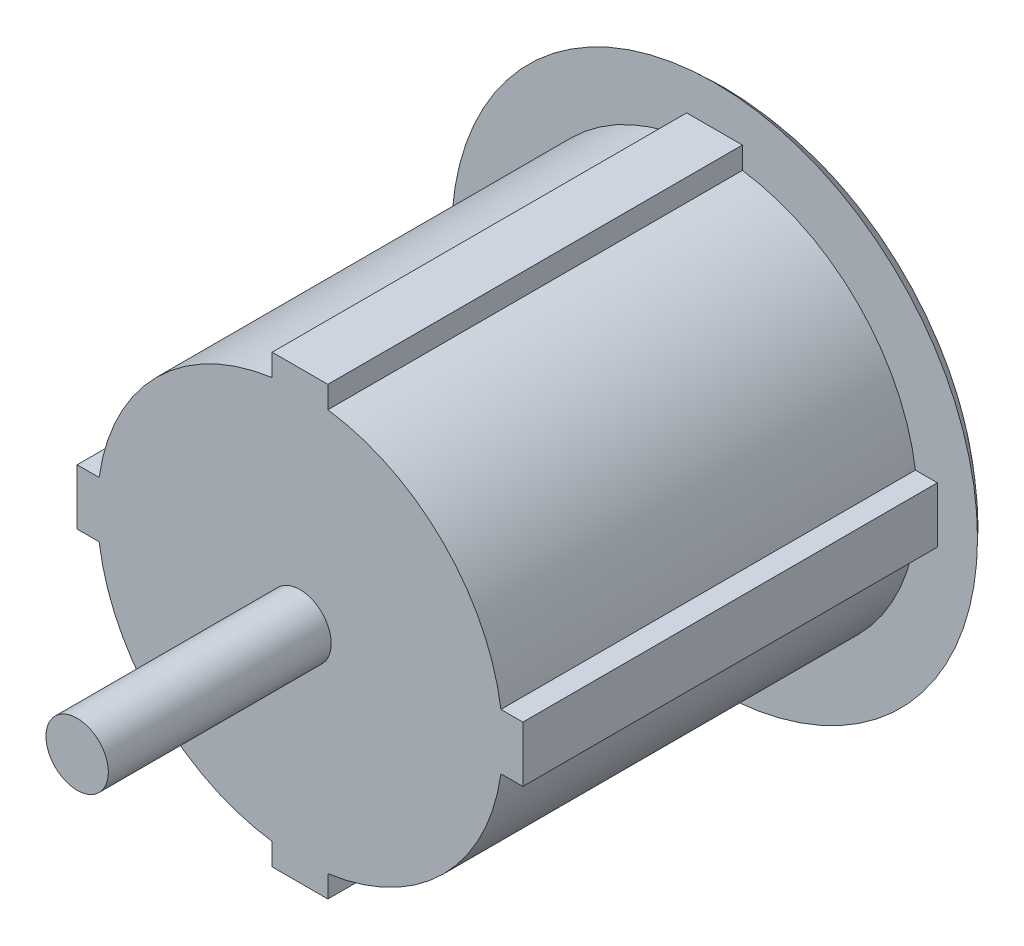
ISO-10303-21;
HEADER;
FILE_DESCRIPTION(('STEP AP214'),'2;1');
FILE_NAME('part.step','',(''),(''),'','','');
FILE_SCHEMA(('AUTOMOTIVE_DESIGN { 1 0 10303 214 1 1 1 1 }'));
ENDSEC;
DATA;
#1=APPLICATION_CONTEXT('core data for automotive mechanical design processes');
#2=APPLICATION_PROTOCOL_DEFINITION('international standard','automotive_design',2000,#1);
#3=PRODUCT_CONTEXT('',#1,'mechanical');
#4=PRODUCT('Part','Part','',(#3));
#5=PRODUCT_RELATED_PRODUCT_CATEGORY('part','',(#4));
#6=PRODUCT_DEFINITION_FORMATION('','',#4);
#7=PRODUCT_DEFINITION_CONTEXT('part definition',#1,'design');
#8=PRODUCT_DEFINITION('design','',#6,#7);
#9=PRODUCT_DEFINITION_SHAPE('','',#8);
#10=(LENGTH_UNIT() NAMED_UNIT(*) SI_UNIT(.MILLI.,.METRE.));
#11=(NAMED_UNIT(*) PLANE_ANGLE_UNIT() SI_UNIT($,.RADIAN.));
#12=(NAMED_UNIT(*) SI_UNIT($,.STERADIAN.) SOLID_ANGLE_UNIT());
#13=UNCERTAINTY_MEASURE_WITH_UNIT(LENGTH_MEASURE(1.E-05),#10,'distance_accuracy_value','');
#14=(GEOMETRIC_REPRESENTATION_CONTEXT(3) GLOBAL_UNCERTAINTY_ASSIGNED_CONTEXT((#13)) GLOBAL_UNIT_ASSIGNED_CONTEXT((#10,
#11,#12)) REPRESENTATION_CONTEXT('',''));
#15=CARTESIAN_POINT('',(0.,0.,0.));
#16=DIRECTION('',(0.,0.,1.));
#17=DIRECTION('',(1.,0.,0.));
#18=AXIS2_PLACEMENT_3D('',#15,#16,#17);
#19=CARTESIAN_POINT('',(0.,0.,20.4));
#20=DIRECTION('',(0.,0.,-1.));
#21=DIRECTION('',(-1.,0.,0.));
#22=AXIS2_PLACEMENT_3D('',#19,#20,#21);
#23=CYLINDRICAL_SURFACE('',#22,9.1);
#24=CARTESIAN_POINT('',(0.,0.,20.4));
#25=DIRECTION('',(0.,0.,1.));
#26=DIRECTION('',(1.,0.,0.));
#27=AXIS2_PLACEMENT_3D('',#24,#25,#26);
#28=CIRCLE('',#27,9.1);
#29=CARTESIAN_POINT('',(9.01373951254416,1.2500000000001,20.4));
#30=VERTEX_POINT('',#29);
#31=CARTESIAN_POINT('',(1.25,9.01373951254417,20.4));
#32=VERTEX_POINT('',#31);
#33=EDGE_CURVE('E277',#30,#32,#28,.T.);
#34=ORIENTED_EDGE('',*,*,#33,.F.);
#35=DIRECTION('',(0.,0.,-1.));
#36=VECTOR('',#35,1.);
#37=CARTESIAN_POINT('',(9.01373951254416,1.2500000000001,20.4));
#38=LINE('',#37,#36);
#39=CARTESIAN_POINT('',(9.01373951254416,1.2500000000001,1.8));
#40=VERTEX_POINT('',#39);
#41=EDGE_CURVE('E181',#30,#40,#38,.T.);
#42=ORIENTED_EDGE('',*,*,#41,.T.);
#43=CARTESIAN_POINT('',(0.,0.,1.8));
#44=DIRECTION('',(0.,0.,-1.));
#45=DIRECTION('',(-1.,0.,0.));
#46=AXIS2_PLACEMENT_3D('',#43,#44,#45);
#47=CIRCLE('',#46,9.1);
#48=CARTESIAN_POINT('',(1.25,9.01373951254417,1.8));
#49=VERTEX_POINT('',#48);
#50=EDGE_CURVE('E175',#49,#40,#47,.T.);
#51=ORIENTED_EDGE('',*,*,#50,.F.);
#52=DIRECTION('',(0.,0.,-1.));
#53=VECTOR('',#52,1.);
#54=CARTESIAN_POINT('',(1.25,9.01373951254417,20.4));
#55=LINE('',#54,#53);
#56=EDGE_CURVE('E250',#49,#32,#55,.F.);
#57=ORIENTED_EDGE('',*,*,#56,.T.);
#58=EDGE_LOOP('',(#34,#42,#51,#57));
#59=FACE_BOUND('',#58,.T.);
#60=ADVANCED_FACE('F37',(#59),#23,.T.);
#61=CARTESIAN_POINT('',(9.01373951254418,-1.2499999999999,1.8));
#62=VERTEX_POINT('',#61);
#63=CARTESIAN_POINT('',(1.25,-9.01373951254417,1.8));
#64=VERTEX_POINT('',#63);
#65=EDGE_CURVE('E282',#62,#64,#47,.T.);
#66=ORIENTED_EDGE('',*,*,#65,.F.);
#67=DIRECTION('',(0.,0.,-1.));
#68=VECTOR('',#67,1.);
#69=CARTESIAN_POINT('',(9.01373951254418,-1.2499999999999,20.4));
#70=LINE('',#69,#68);
#71=CARTESIAN_POINT('',(9.01373951254418,-1.2499999999999,20.4));
#72=VERTEX_POINT('',#71);
#73=EDGE_CURVE('E53',#62,#72,#70,.F.);
#74=ORIENTED_EDGE('',*,*,#73,.T.);
#75=CARTESIAN_POINT('',(1.25,-9.01373951254417,20.4));
#76=VERTEX_POINT('',#75);
#77=EDGE_CURVE('E626',#76,#72,#28,.T.);
#78=ORIENTED_EDGE('',*,*,#77,.F.);
#79=DIRECTION('',(0.,0.,-1.));
#80=VECTOR('',#79,1.);
#81=CARTESIAN_POINT('',(1.25,-9.01373951254417,20.4));
#82=LINE('',#81,#80);
#83=EDGE_CURVE('E203',#76,#64,#82,.T.);
#84=ORIENTED_EDGE('',*,*,#83,.T.);
#85=EDGE_LOOP('',(#66,#74,#78,#84));
#86=FACE_BOUND('',#85,.T.);
#87=ADVANCED_FACE('F292',(#86),#23,.T.);
#88=CARTESIAN_POINT('',(-1.25,-9.01373951254417,1.8));
#89=VERTEX_POINT('',#88);
#90=CARTESIAN_POINT('',(-9.01373951254416,-1.25000000000003,1.8));
#91=VERTEX_POINT('',#90);
#92=EDGE_CURVE('E295',#89,#91,#47,.T.);
#93=ORIENTED_EDGE('',*,*,#92,.F.);
#94=DIRECTION('',(0.,0.,-1.));
#95=VECTOR('',#94,1.);
#96=CARTESIAN_POINT('',(-1.25,-9.01373951254417,20.4));
#97=LINE('',#96,#95);
#98=CARTESIAN_POINT('',(-1.25,-9.01373951254417,20.4));
#99=VERTEX_POINT('',#98);
#100=EDGE_CURVE('E61',#89,#99,#97,.F.);
#101=ORIENTED_EDGE('',*,*,#100,.T.);
#102=CARTESIAN_POINT('',(-9.01373951254416,-1.25000000000003,20.4));
#103=VERTEX_POINT('',#102);
#104=EDGE_CURVE('E276',#103,#99,#28,.T.);
#105=ORIENTED_EDGE('',*,*,#104,.F.);
#106=DIRECTION('',(0.,0.,-1.));
#107=VECTOR('',#106,1.);
#108=CARTESIAN_POINT('',(-9.01373951254416,-1.25000000000003,20.4));
#109=LINE('',#108,#107);
#110=EDGE_CURVE('E228',#103,#91,#109,.T.);
#111=ORIENTED_EDGE('',*,*,#110,.T.);
#112=EDGE_LOOP('',(#93,#101,#105,#111));
#113=FACE_BOUND('',#112,.T.);
#114=ADVANCED_FACE('F342',(#113),#23,.T.);
#115=CARTESIAN_POINT('',(-9.01373951254418,1.24999999999997,1.8));
#116=VERTEX_POINT('',#115);
#117=CARTESIAN_POINT('',(-1.25,9.01373951254417,1.8));
#118=VERTEX_POINT('',#117);
#119=EDGE_CURVE('E275',#116,#118,#47,.T.);
#120=ORIENTED_EDGE('',*,*,#119,.F.);
#121=DIRECTION('',(0.,0.,-1.));
#122=VECTOR('',#121,1.);
#123=CARTESIAN_POINT('',(-9.01373951254417,1.24999999999997,20.4));
#124=LINE('',#123,#122);
#125=CARTESIAN_POINT('',(-9.01373951254418,1.24999999999997,20.4));
#126=VERTEX_POINT('',#125);
#127=EDGE_CURVE('E225',#116,#126,#124,.F.);
#128=ORIENTED_EDGE('',*,*,#127,.T.);
#129=CARTESIAN_POINT('',(-1.25,9.01373951254417,20.4));
#130=VERTEX_POINT('',#129);
#131=EDGE_CURVE('E272',#130,#126,#28,.T.);
#132=ORIENTED_EDGE('',*,*,#131,.F.);
#133=DIRECTION('',(0.,0.,-1.));
#134=VECTOR('',#133,1.);
#135=CARTESIAN_POINT('',(-1.25,9.01373951254417,20.4));
#136=LINE('',#135,#134);
#137=EDGE_CURVE('E253',#130,#118,#136,.T.);
#138=ORIENTED_EDGE('',*,*,#137,.T.);
#139=EDGE_LOOP('',(#120,#128,#132,#138));
#140=FACE_BOUND('',#139,.T.);
#141=ADVANCED_FACE('F39',(#140),#23,.T.);
#142=CARTESIAN_POINT('',(0.,0.,20.4));
#143=DIRECTION('',(0.,0.,1.));
#144=DIRECTION('',(1.,0.,0.));
#145=AXIS2_PLACEMENT_3D('',#142,#143,#144);
#146=PLANE('',#145);
#147=CARTESIAN_POINT('',(0.,0.,20.4));
#148=DIRECTION('',(0.,0.,1.));
#149=DIRECTION('',(1.,0.,0.));
#150=AXIS2_PLACEMENT_3D('',#147,#148,#149);
#151=CIRCLE('',#150,1.4);
#152=CARTESIAN_POINT('',(1.4,0.,20.4));
#153=VERTEX_POINT('',#152);
#154=EDGE_CURVE('E11',#153,#153,#151,.T.);
#155=ORIENTED_EDGE('',*,*,#154,.F.);
#156=EDGE_LOOP('',(#155));
#157=FACE_BOUND('',#156,.T.);
#158=ORIENTED_EDGE('',*,*,#77,.T.);
#159=DIRECTION('',(1.,0.,0.));
#160=VECTOR('',#159,1.);
#161=CARTESIAN_POINT('',(10.,-1.24999999999989,20.4));
#162=LINE('',#161,#160);
#163=CARTESIAN_POINT('',(10.,-1.24999999999989,20.4));
#164=VERTEX_POINT('',#163);
#165=EDGE_CURVE('E318',#72,#164,#162,.T.);
#166=ORIENTED_EDGE('',*,*,#165,.T.);
#167=DIRECTION('',(0.,1.,0.));
#168=VECTOR('',#167,1.);
#169=CARTESIAN_POINT('',(9.99999999999999,1.25000000000011,20.4));
#170=LINE('',#169,#168);
#171=CARTESIAN_POINT('',(9.99999999999999,1.25000000000011,20.4));
#172=VERTEX_POINT('',#171);
#173=EDGE_CURVE('E316',#164,#172,#170,.T.);
#174=ORIENTED_EDGE('',*,*,#173,.T.);
#175=DIRECTION('',(-1.,0.,0.));
#176=VECTOR('',#175,1.);
#177=CARTESIAN_POINT('',(9.99999999999999,1.25000000000011,20.4));
#178=LINE('',#177,#176);
#179=EDGE_CURVE('E157',#172,#30,#178,.T.);
#180=ORIENTED_EDGE('',*,*,#179,.T.);
#181=ORIENTED_EDGE('',*,*,#33,.T.);
#182=DIRECTION('',(0.,1.,0.));
#183=VECTOR('',#182,1.);
#184=CARTESIAN_POINT('',(1.25,10.,20.4));
#185=LINE('',#184,#183);
#186=CARTESIAN_POINT('',(1.25,10.,20.4));
#187=VERTEX_POINT('',#186);
#188=EDGE_CURVE('E231',#32,#187,#185,.T.);
#189=ORIENTED_EDGE('',*,*,#188,.T.);
#190=DIRECTION('',(-1.,0.,0.));
#191=VECTOR('',#190,1.);
#192=CARTESIAN_POINT('',(-1.25,10.,20.4));
#193=LINE('',#192,#191);
#194=CARTESIAN_POINT('',(-1.25,10.,20.4));
#195=VERTEX_POINT('',#194);
#196=EDGE_CURVE('E236',#187,#195,#193,.T.);
#197=ORIENTED_EDGE('',*,*,#196,.T.);
#198=DIRECTION('',(0.,-1.,0.));
#199=VECTOR('',#198,1.);
#200=CARTESIAN_POINT('',(-1.25,10.,20.4));
#201=LINE('',#200,#199);
#202=EDGE_CURVE('E232',#195,#130,#201,.T.);
#203=ORIENTED_EDGE('',*,*,#202,.T.);
#204=ORIENTED_EDGE('',*,*,#131,.T.);
#205=DIRECTION('',(-1.,0.,0.));
#206=VECTOR('',#205,1.);
#207=CARTESIAN_POINT('',(-10.,1.24999999999996,20.4));
#208=LINE('',#207,#206);
#209=CARTESIAN_POINT('',(-10.,1.24999999999996,20.4));
#210=VERTEX_POINT('',#209);
#211=EDGE_CURVE('E206',#126,#210,#208,.T.);
#212=ORIENTED_EDGE('',*,*,#211,.T.);
#213=DIRECTION('',(0.,-1.,0.));
#214=VECTOR('',#213,1.);
#215=CARTESIAN_POINT('',(-9.99999999999999,-1.25000000000004,20.4));
#216=LINE('',#215,#214);
#217=CARTESIAN_POINT('',(-9.99999999999999,-1.25000000000004,20.4));
#218=VERTEX_POINT('',#217);
#219=EDGE_CURVE('E211',#210,#218,#216,.T.);
#220=ORIENTED_EDGE('',*,*,#219,.T.);
#221=DIRECTION('',(1.,0.,0.));
#222=VECTOR('',#221,1.);
#223=CARTESIAN_POINT('',(-9.99999999999999,-1.25000000000004,20.4));
#224=LINE('',#223,#222);
#225=EDGE_CURVE('E207',#218,#103,#224,.T.);
#226=ORIENTED_EDGE('',*,*,#225,.T.);
#227=ORIENTED_EDGE('',*,*,#104,.T.);
#228=DIRECTION('',(0.,-1.,0.));
#229=VECTOR('',#228,1.);
#230=CARTESIAN_POINT('',(-1.25,-10.,20.4));
#231=LINE('',#230,#229);
#232=CARTESIAN_POINT('',(-1.25,-10.,20.4));
#233=VERTEX_POINT('',#232);
#234=EDGE_CURVE('E183',#99,#233,#231,.T.);
#235=ORIENTED_EDGE('',*,*,#234,.T.);
#236=DIRECTION('',(1.,0.,0.));
#237=VECTOR('',#236,1.);
#238=CARTESIAN_POINT('',(1.25,-10.,20.4));
#239=LINE('',#238,#237);
#240=CARTESIAN_POINT('',(1.25,-10.,20.4));
#241=VERTEX_POINT('',#240);
#242=EDGE_CURVE('E188',#233,#241,#239,.T.);
#243=ORIENTED_EDGE('',*,*,#242,.T.);
#244=DIRECTION('',(0.,1.,0.));
#245=VECTOR('',#244,1.);
#246=CARTESIAN_POINT('',(1.25,-10.,20.4));
#247=LINE('',#246,#245);
#248=EDGE_CURVE('E184',#241,#76,#247,.T.);
#249=ORIENTED_EDGE('',*,*,#248,.T.);
#250=EDGE_LOOP('',(#158,#166,#174,#180,#181,#189,#197,#203,#204,#212,#220,#226,#227,#235,#243,#249));
#251=FACE_BOUND('',#250,.T.);
#252=ADVANCED_FACE('F307',(#157,#251),#146,.T.);
#253=CARTESIAN_POINT('',(0.,0.,5.70630595396058));
#254=DIRECTION('',(0.,0.,1.));
#255=DIRECTION('',(1.,0.,0.));
#256=AXIS2_PLACEMENT_3D('',#253,#254,#255);
#257=TOROIDAL_SURFACE('',#256,7.24579603069295,6.);
#258=CARTESIAN_POINT('',(0.,0.,1.8));
#259=DIRECTION('',(0.,0.,1.));
#260=DIRECTION('',(1.,0.,0.));
#261=AXIS2_PLACEMENT_3D('',#258,#259,#260);
#262=CIRCLE('',#261,11.8);
#263=CARTESIAN_POINT('',(11.8,0.,1.8));
#264=VERTEX_POINT('',#263);
#265=EDGE_CURVE('E266',#264,#264,#262,.T.);
#266=ORIENTED_EDGE('',*,*,#265,.F.);
#267=EDGE_LOOP('',(#266));
#268=FACE_BOUND('',#267,.T.);
#269=CARTESIAN_POINT('',(0.,0.,0.));
#270=DIRECTION('',(0.,0.,1.));
#271=DIRECTION('',(1.,0.,0.));
#272=AXIS2_PLACEMENT_3D('',#269,#270,#271);
#273=CIRCLE('',#272,9.1);
#274=CARTESIAN_POINT('',(9.1,0.,0.));
#275=VERTEX_POINT('',#274);
#276=EDGE_CURVE('E271',#275,#275,#273,.T.);
#277=ORIENTED_EDGE('',*,*,#276,.T.);
#278=EDGE_LOOP('',(#277));
#279=FACE_BOUND('',#278,.T.);
#280=ADVANCED_FACE('F334',(#268,#279),#257,.T.);
#281=CARTESIAN_POINT('',(0.,9.1,1.8));
#282=DIRECTION('',(0.,0.,-1.));
#283=DIRECTION('',(-1.,0.,0.));
#284=AXIS2_PLACEMENT_3D('',#281,#282,#283);
#285=PLANE('',#284);
#286=ORIENTED_EDGE('',*,*,#50,.T.);
#287=DIRECTION('',(-1.,0.,0.));
#288=VECTOR('',#287,1.);
#289=CARTESIAN_POINT('',(9.99999999999999,1.25000000000011,1.8));
#290=LINE('',#289,#288);
#291=CARTESIAN_POINT('',(9.99999999999999,1.25000000000011,1.8));
#292=VERTEX_POINT('',#291);
#293=EDGE_CURVE('E154',#292,#40,#290,.T.);
#294=ORIENTED_EDGE('',*,*,#293,.F.);
#295=DIRECTION('',(0.,1.,0.));
#296=VECTOR('',#295,1.);
#297=CARTESIAN_POINT('',(9.99999999999999,1.25000000000011,1.8));
#298=LINE('',#297,#296);
#299=CARTESIAN_POINT('',(10.,-1.24999999999989,1.8));
#300=VERTEX_POINT('',#299);
#301=EDGE_CURVE('E161',#300,#292,#298,.T.);
#302=ORIENTED_EDGE('',*,*,#301,.F.);
#303=DIRECTION('',(-1.,0.,0.));
#304=VECTOR('',#303,1.);
#305=CARTESIAN_POINT('',(1.10654794068124E-13,-1.25,1.8));
#306=LINE('',#305,#304);
#307=EDGE_CURVE('E41',#300,#62,#306,.T.);
#308=ORIENTED_EDGE('',*,*,#307,.T.);
#309=ORIENTED_EDGE('',*,*,#65,.T.);
#310=DIRECTION('',(0.,1.,0.));
#311=VECTOR('',#310,1.);
#312=CARTESIAN_POINT('',(1.25,-10.,1.8));
#313=LINE('',#312,#311);
#314=CARTESIAN_POINT('',(1.25,-10.,1.8));
#315=VERTEX_POINT('',#314);
#316=EDGE_CURVE('E195',#315,#64,#313,.T.);
#317=ORIENTED_EDGE('',*,*,#316,.F.);
#318=DIRECTION('',(1.,0.,0.));
#319=VECTOR('',#318,1.);
#320=CARTESIAN_POINT('',(1.25,-10.,1.8));
#321=LINE('',#320,#319);
#322=CARTESIAN_POINT('',(-1.25,-10.,1.8));
#323=VERTEX_POINT('',#322);
#324=EDGE_CURVE('E187',#323,#315,#321,.T.);
#325=ORIENTED_EDGE('',*,*,#324,.F.);
#326=DIRECTION('',(0.,1.,0.));
#327=VECTOR('',#326,1.);
#328=CARTESIAN_POINT('',(-1.25,9.1,1.8));
#329=LINE('',#328,#327);
#330=EDGE_CURVE('E286',#323,#89,#329,.T.);
#331=ORIENTED_EDGE('',*,*,#330,.T.);
#332=ORIENTED_EDGE('',*,*,#92,.T.);
#333=DIRECTION('',(1.,0.,0.));
#334=VECTOR('',#333,1.);
#335=CARTESIAN_POINT('',(-9.99999999999999,-1.25000000000004,1.8));
#336=LINE('',#335,#334);
#337=CARTESIAN_POINT('',(-9.99999999999999,-1.25000000000004,1.8));
#338=VERTEX_POINT('',#337);
#339=EDGE_CURVE('E218',#338,#91,#336,.T.);
#340=ORIENTED_EDGE('',*,*,#339,.F.);
#341=DIRECTION('',(0.,-1.,0.));
#342=VECTOR('',#341,1.);
#343=CARTESIAN_POINT('',(-9.99999999999999,-1.25000000000004,1.8));
#344=LINE('',#343,#342);
#345=CARTESIAN_POINT('',(-10.,1.24999999999996,1.8));
#346=VERTEX_POINT('',#345);
#347=EDGE_CURVE('E210',#346,#338,#344,.T.);
#348=ORIENTED_EDGE('',*,*,#347,.F.);
#349=DIRECTION('',(1.,0.,0.));
#350=VECTOR('',#349,1.);
#351=CARTESIAN_POINT('',(0.,1.25,1.8));
#352=LINE('',#351,#350);
#353=EDGE_CURVE('E284',#346,#116,#352,.T.);
#354=ORIENTED_EDGE('',*,*,#353,.T.);
#355=ORIENTED_EDGE('',*,*,#119,.T.);
#356=DIRECTION('',(0.,-1.,0.));
#357=VECTOR('',#356,1.);
#358=CARTESIAN_POINT('',(-1.25,10.,1.8));
#359=LINE('',#358,#357);
#360=CARTESIAN_POINT('',(-1.25,10.,1.8));
#361=VERTEX_POINT('',#360);
#362=EDGE_CURVE('E243',#361,#118,#359,.T.);
#363=ORIENTED_EDGE('',*,*,#362,.F.);
#364=DIRECTION('',(-1.,0.,0.));
#365=VECTOR('',#364,1.);
#366=CARTESIAN_POINT('',(-1.25,10.,1.8));
#367=LINE('',#366,#365);
#368=CARTESIAN_POINT('',(1.25,10.,1.8));
#369=VERTEX_POINT('',#368);
#370=EDGE_CURVE('E235',#369,#361,#367,.T.);
#371=ORIENTED_EDGE('',*,*,#370,.F.);
#372=DIRECTION('',(0.,-1.,0.));
#373=VECTOR('',#372,1.);
#374=CARTESIAN_POINT('',(1.25,9.1,1.8));
#375=LINE('',#374,#373);
#376=EDGE_CURVE('E281',#369,#49,#375,.T.);
#377=ORIENTED_EDGE('',*,*,#376,.T.);
#378=EDGE_LOOP('',(#286,#294,#302,#308,#309,#317,#325,#331,#332,#340,#348,#354,#355,#363,#371,#377));
#379=FACE_BOUND('',#378,.T.);
#380=ORIENTED_EDGE('',*,*,#265,.T.);
#381=EDGE_LOOP('',(#380));
#382=FACE_BOUND('',#381,.T.);
#383=ADVANCED_FACE('F171',(#379,#382),#285,.F.);
#384=CARTESIAN_POINT('',(0.,0.,0.));
#385=DIRECTION('',(0.,0.,1.));
#386=DIRECTION('',(1.,0.,0.));
#387=AXIS2_PLACEMENT_3D('',#384,#385,#386);
#388=PLANE('',#387);
#389=CARTESIAN_POINT('',(0.,0.,0.));
#390=DIRECTION('',(0.,0.,-1.));
#391=DIRECTION('',(-1.,0.,0.));
#392=AXIS2_PLACEMENT_3D('',#389,#390,#391);
#393=CIRCLE('',#392,8.29473713611086);
#394=CARTESIAN_POINT('',(-8.29473713611086,0.,0.));
#395=VERTEX_POINT('',#394);
#396=EDGE_CURVE('E260',#395,#395,#393,.T.);
#397=ORIENTED_EDGE('',*,*,#396,.F.);
#398=EDGE_LOOP('',(#397));
#399=FACE_BOUND('',#398,.T.);
#400=ORIENTED_EDGE('',*,*,#276,.F.);
#401=EDGE_LOOP('',(#400));
#402=FACE_BOUND('',#401,.T.);
#403=ADVANCED_FACE('F396',(#399,#402),#388,.F.);
#404=CARTESIAN_POINT('',(0.,0.,0.5));
#405=DIRECTION('',(0.,0.,-1.));
#406=DIRECTION('',(-1.,0.,0.));
#407=AXIS2_PLACEMENT_3D('',#404,#405,#406);
#408=CYLINDRICAL_SURFACE('',#407,8.29473713611086);
#409=CARTESIAN_POINT('',(0.,0.,0.5));
#410=DIRECTION('',(0.,0.,-1.));
#411=DIRECTION('',(-1.,0.,0.));
#412=AXIS2_PLACEMENT_3D('',#409,#410,#411);
#413=CIRCLE('',#412,8.29473713611086);
#414=CARTESIAN_POINT('',(-8.29473713611086,0.,0.5));
#415=VERTEX_POINT('',#414);
#416=EDGE_CURVE('E263',#415,#415,#413,.T.);
#417=ORIENTED_EDGE('',*,*,#416,.F.);
#418=EDGE_LOOP('',(#417));
#419=FACE_BOUND('',#418,.T.);
#420=ORIENTED_EDGE('',*,*,#396,.T.);
#421=EDGE_LOOP('',(#420));
#422=FACE_BOUND('',#421,.T.);
#423=ADVANCED_FACE('F392',(#419,#422),#408,.F.);
#424=CARTESIAN_POINT('',(0.,0.,0.5));
#425=DIRECTION('',(0.,0.,-1.));
#426=DIRECTION('',(-1.,0.,0.));
#427=AXIS2_PLACEMENT_3D('',#424,#425,#426);
#428=PLANE('',#427);
#429=CARTESIAN_POINT('',(0.,0.,0.5));
#430=DIRECTION('',(0.,0.,-1.));
#431=DIRECTION('',(-1.,0.,0.));
#432=AXIS2_PLACEMENT_3D('',#429,#430,#431);
#433=CIRCLE('',#432,7.29473713611086);
#434=CARTESIAN_POINT('',(-7.29473713611086,0.,0.5));
#435=VERTEX_POINT('',#434);
#436=EDGE_CURVE('E257',#435,#435,#433,.T.);
#437=ORIENTED_EDGE('',*,*,#436,.F.);
#438=EDGE_LOOP('',(#437));
#439=FACE_BOUND('',#438,.T.);
#440=ORIENTED_EDGE('',*,*,#416,.T.);
#441=EDGE_LOOP('',(#440));
#442=FACE_BOUND('',#441,.T.);
#443=ADVANCED_FACE('F388',(#439,#442),#428,.T.);
#444=CARTESIAN_POINT('',(0.,0.,0.5));
#445=DIRECTION('',(0.,0.,-1.));
#446=DIRECTION('',(-1.,0.,0.));
#447=AXIS2_PLACEMENT_3D('',#444,#445,#446);
#448=CYLINDRICAL_SURFACE('',#447,7.29473713611086);
#449=ORIENTED_EDGE('',*,*,#436,.T.);
#450=EDGE_LOOP('',(#449));
#451=FACE_BOUND('',#450,.T.);
#452=CARTESIAN_POINT('',(0.,0.,0.));
#453=DIRECTION('',(0.,0.,-1.));
#454=DIRECTION('',(-1.,0.,0.));
#455=AXIS2_PLACEMENT_3D('',#452,#453,#454);
#456=CIRCLE('',#455,7.29473713611086);
#457=CARTESIAN_POINT('',(-7.29473713611086,0.,0.));
#458=VERTEX_POINT('',#457);
#459=EDGE_CURVE('E256',#458,#458,#456,.T.);
#460=ORIENTED_EDGE('',*,*,#459,.F.);
#461=EDGE_LOOP('',(#460));
#462=FACE_BOUND('',#461,.T.);
#463=ADVANCED_FACE('F385',(#451,#462),#448,.T.);
#464=ORIENTED_EDGE('',*,*,#459,.T.);
#465=EDGE_LOOP('',(#464));
#466=FACE_BOUND('',#465,.T.);
#467=ADVANCED_FACE('F382',(#466),#388,.F.);
#468=CARTESIAN_POINT('',(-1.25,10.,-1.40156211871642));
#469=DIRECTION('',(-1.,0.,0.));
#470=DIRECTION('',(0.,-1.,0.));
#471=AXIS2_PLACEMENT_3D('',#468,#469,#470);
#472=PLANE('',#471);
#473=ORIENTED_EDGE('',*,*,#137,.F.);
#474=ORIENTED_EDGE('',*,*,#202,.F.);
#475=DIRECTION('',(0.,0.,1.));
#476=VECTOR('',#475,1.);
#477=CARTESIAN_POINT('',(-1.25,10.,-1.40156211871642));
#478=LINE('',#477,#476);
#479=EDGE_CURVE('E242',#361,#195,#478,.T.);
#480=ORIENTED_EDGE('',*,*,#479,.F.);
#481=ORIENTED_EDGE('',*,*,#362,.T.);
#482=EDGE_LOOP('',(#473,#474,#480,#481));
#483=FACE_BOUND('',#482,.T.);
#484=ADVANCED_FACE('F303',(#483),#472,.T.);
#485=CARTESIAN_POINT('',(1.25,10.,-1.40156211871642));
#486=DIRECTION('',(1.,0.,0.));
#487=DIRECTION('',(0.,1.,0.));
#488=AXIS2_PLACEMENT_3D('',#485,#486,#487);
#489=PLANE('',#488);
#490=ORIENTED_EDGE('',*,*,#56,.F.);
#491=ORIENTED_EDGE('',*,*,#376,.F.);
#492=DIRECTION('',(0.,0.,1.));
#493=VECTOR('',#492,1.);
#494=CARTESIAN_POINT('',(1.25,10.,-1.40156211871642));
#495=LINE('',#494,#493);
#496=EDGE_CURVE('E246',#369,#187,#495,.T.);
#497=ORIENTED_EDGE('',*,*,#496,.T.);
#498=ORIENTED_EDGE('',*,*,#188,.F.);
#499=EDGE_LOOP('',(#490,#491,#497,#498));
#500=FACE_BOUND('',#499,.T.);
#501=ADVANCED_FACE('F377',(#500),#489,.T.);
#502=CARTESIAN_POINT('',(-1.25,10.,-1.40156211871642));
#503=DIRECTION('',(0.,1.,0.));
#504=DIRECTION('',(0.,0.,1.));
#505=AXIS2_PLACEMENT_3D('',#502,#503,#504);
#506=PLANE('',#505);
#507=ORIENTED_EDGE('',*,*,#496,.F.);
#508=ORIENTED_EDGE('',*,*,#370,.T.);
#509=ORIENTED_EDGE('',*,*,#479,.T.);
#510=ORIENTED_EDGE('',*,*,#196,.F.);
#511=EDGE_LOOP('',(#507,#508,#509,#510));
#512=FACE_BOUND('',#511,.T.);
#513=ADVANCED_FACE('F312',(#512),#506,.T.);
#514=CARTESIAN_POINT('',(-9.99999999999999,-1.25000000000004,-1.40156211871644));
#515=DIRECTION('',(0.,-1.,0.));
#516=DIRECTION('',(1.,0.,0.));
#517=AXIS2_PLACEMENT_3D('',#514,#515,#516);
#518=PLANE('',#517);
#519=ORIENTED_EDGE('',*,*,#110,.F.);
#520=ORIENTED_EDGE('',*,*,#225,.F.);
#521=DIRECTION('',(0.,0.,1.));
#522=VECTOR('',#521,1.);
#523=CARTESIAN_POINT('',(-9.99999999999999,-1.25000000000004,-1.40156211871644));
#524=LINE('',#523,#522);
#525=EDGE_CURVE('E217',#338,#218,#524,.T.);
#526=ORIENTED_EDGE('',*,*,#525,.F.);
#527=ORIENTED_EDGE('',*,*,#339,.T.);
#528=EDGE_LOOP('',(#519,#520,#526,#527));
#529=FACE_BOUND('',#528,.T.);
#530=ADVANCED_FACE('F357',(#529),#518,.T.);
#531=CARTESIAN_POINT('',(-10.,1.24999999999996,-1.40156211871644));
#532=DIRECTION('',(0.,1.,0.));
#533=DIRECTION('',(-1.,0.,0.));
#534=AXIS2_PLACEMENT_3D('',#531,#532,#533);
#535=PLANE('',#534);
#536=ORIENTED_EDGE('',*,*,#127,.F.);
#537=ORIENTED_EDGE('',*,*,#353,.F.);
#538=DIRECTION('',(0.,0.,1.));
#539=VECTOR('',#538,1.);
#540=CARTESIAN_POINT('',(-10.,1.24999999999996,-1.40156211871644));
#541=LINE('',#540,#539);
#542=EDGE_CURVE('E221',#346,#210,#541,.T.);
#543=ORIENTED_EDGE('',*,*,#542,.T.);
#544=ORIENTED_EDGE('',*,*,#211,.F.);
#545=EDGE_LOOP('',(#536,#537,#543,#544));
#546=FACE_BOUND('',#545,.T.);
#547=ADVANCED_FACE('F363',(#546),#535,.T.);
#548=CARTESIAN_POINT('',(-9.99999999999999,-1.25000000000004,-1.40156211871644));
#549=DIRECTION('',(-1.,0.,0.));
#550=DIRECTION('',(0.,-1.,0.));
#551=AXIS2_PLACEMENT_3D('',#548,#549,#550);
#552=PLANE('',#551);
#553=ORIENTED_EDGE('',*,*,#542,.F.);
#554=ORIENTED_EDGE('',*,*,#347,.T.);
#555=ORIENTED_EDGE('',*,*,#525,.T.);
#556=ORIENTED_EDGE('',*,*,#219,.F.);
#557=EDGE_LOOP('',(#553,#554,#555,#556));
#558=FACE_BOUND('',#557,.T.);
#559=ADVANCED_FACE('F361',(#558),#552,.T.);
#560=CARTESIAN_POINT('',(1.25,-10.,-1.40156211871642));
#561=DIRECTION('',(1.,0.,0.));
#562=DIRECTION('',(0.,1.,0.));
#563=AXIS2_PLACEMENT_3D('',#560,#561,#562);
#564=PLANE('',#563);
#565=ORIENTED_EDGE('',*,*,#83,.F.);
#566=ORIENTED_EDGE('',*,*,#248,.F.);
#567=DIRECTION('',(0.,0.,1.));
#568=VECTOR('',#567,1.);
#569=CARTESIAN_POINT('',(1.25,-10.,-1.40156211871642));
#570=LINE('',#569,#568);
#571=EDGE_CURVE('E194',#315,#241,#570,.T.);
#572=ORIENTED_EDGE('',*,*,#571,.F.);
#573=ORIENTED_EDGE('',*,*,#316,.T.);
#574=EDGE_LOOP('',(#565,#566,#572,#573));
#575=FACE_BOUND('',#574,.T.);
#576=ADVANCED_FACE('F370',(#575),#564,.T.);
#577=CARTESIAN_POINT('',(-1.25,-10.,-1.40156211871642));
#578=DIRECTION('',(-1.,0.,0.));
#579=DIRECTION('',(0.,-1.,0.));
#580=AXIS2_PLACEMENT_3D('',#577,#578,#579);
#581=PLANE('',#580);
#582=ORIENTED_EDGE('',*,*,#100,.F.);
#583=ORIENTED_EDGE('',*,*,#330,.F.);
#584=DIRECTION('',(0.,0.,1.));
#585=VECTOR('',#584,1.);
#586=CARTESIAN_POINT('',(-1.25,-10.,-1.40156211871642));
#587=LINE('',#586,#585);
#588=EDGE_CURVE('E198',#323,#233,#587,.T.);
#589=ORIENTED_EDGE('',*,*,#588,.T.);
#590=ORIENTED_EDGE('',*,*,#234,.F.);
#591=EDGE_LOOP('',(#582,#583,#589,#590));
#592=FACE_BOUND('',#591,.T.);
#593=ADVANCED_FACE('F458',(#592),#581,.T.);
#594=CARTESIAN_POINT('',(1.25,-10.,-1.40156211871642));
#595=DIRECTION('',(0.,-1.,0.));
#596=DIRECTION('',(0.,0.,-1.));
#597=AXIS2_PLACEMENT_3D('',#594,#595,#596);
#598=PLANE('',#597);
#599=ORIENTED_EDGE('',*,*,#588,.F.);
#600=ORIENTED_EDGE('',*,*,#324,.T.);
#601=ORIENTED_EDGE('',*,*,#571,.T.);
#602=ORIENTED_EDGE('',*,*,#242,.F.);
#603=EDGE_LOOP('',(#599,#600,#601,#602));
#604=FACE_BOUND('',#603,.T.);
#605=ADVANCED_FACE('F374',(#604),#598,.T.);
#606=CARTESIAN_POINT('',(9.99999999999999,1.25000000000011,-1.40156211871646));
#607=DIRECTION('',(0.,1.,0.));
#608=DIRECTION('',(-1.,0.,0.));
#609=AXIS2_PLACEMENT_3D('',#606,#607,#608);
#610=PLANE('',#609);
#611=ORIENTED_EDGE('',*,*,#41,.F.);
#612=ORIENTED_EDGE('',*,*,#179,.F.);
#613=DIRECTION('',(0.,0.,1.));
#614=VECTOR('',#613,1.);
#615=CARTESIAN_POINT('',(9.99999999999999,1.25000000000011,-1.40156211871646));
#616=LINE('',#615,#614);
#617=EDGE_CURVE('E150',#292,#172,#616,.T.);
#618=ORIENTED_EDGE('',*,*,#617,.F.);
#619=ORIENTED_EDGE('',*,*,#293,.T.);
#620=EDGE_LOOP('',(#611,#612,#618,#619));
#621=FACE_BOUND('',#620,.T.);
#622=ADVANCED_FACE('F152',(#621),#610,.T.);
#623=CARTESIAN_POINT('',(10.,-1.24999999999989,-1.40156211871646));
#624=DIRECTION('',(0.,-1.,0.));
#625=DIRECTION('',(1.,0.,0.));
#626=AXIS2_PLACEMENT_3D('',#623,#624,#625);
#627=PLANE('',#626);
#628=ORIENTED_EDGE('',*,*,#73,.F.);
#629=ORIENTED_EDGE('',*,*,#307,.F.);
#630=DIRECTION('',(0.,0.,1.));
#631=VECTOR('',#630,1.);
#632=CARTESIAN_POINT('',(10.,-1.24999999999989,-1.40156211871646));
#633=LINE('',#632,#631);
#634=EDGE_CURVE('E167',#300,#164,#633,.T.);
#635=ORIENTED_EDGE('',*,*,#634,.T.);
#636=ORIENTED_EDGE('',*,*,#165,.F.);
#637=EDGE_LOOP('',(#628,#629,#635,#636));
#638=FACE_BOUND('',#637,.T.);
#639=ADVANCED_FACE('F472',(#638),#627,.T.);
#640=CARTESIAN_POINT('',(9.99999999999999,1.25000000000011,-1.40156211871646));
#641=DIRECTION('',(1.,0.,0.));
#642=DIRECTION('',(0.,1.,0.));
#643=AXIS2_PLACEMENT_3D('',#640,#641,#642);
#644=PLANE('',#643);
#645=ORIENTED_EDGE('',*,*,#634,.F.);
#646=ORIENTED_EDGE('',*,*,#301,.T.);
#647=ORIENTED_EDGE('',*,*,#617,.T.);
#648=ORIENTED_EDGE('',*,*,#173,.F.);
#649=EDGE_LOOP('',(#645,#646,#647,#648));
#650=FACE_BOUND('',#649,.T.);
#651=ADVANCED_FACE('F165',(#650),#644,.T.);
#652=CARTESIAN_POINT('',(0.,0.,30.4));
#653=DIRECTION('',(0.,0.,-1.));
#654=DIRECTION('',(-1.,0.,0.));
#655=AXIS2_PLACEMENT_3D('',#652,#653,#654);
#656=CYLINDRICAL_SURFACE('',#655,1.4);
#657=CARTESIAN_POINT('',(0.,0.,30.4));
#658=DIRECTION('',(0.,0.,1.));
#659=DIRECTION('',(1.,0.,0.));
#660=AXIS2_PLACEMENT_3D('',#657,#658,#659);
#661=CIRCLE('',#660,1.4);
#662=CARTESIAN_POINT('',(1.4,0.,30.4));
#663=VERTEX_POINT('',#662);
#664=EDGE_CURVE('E321',#663,#663,#661,.T.);
#665=ORIENTED_EDGE('',*,*,#664,.F.);
#666=EDGE_LOOP('',(#665));
#667=FACE_BOUND('',#666,.T.);
#668=ORIENTED_EDGE('',*,*,#154,.T.);
#669=EDGE_LOOP('',(#668));
#670=FACE_BOUND('',#669,.T.);
#671=ADVANCED_FACE('F327',(#667,#670),#656,.T.);
#672=CARTESIAN_POINT('',(0.,0.,30.4));
#673=DIRECTION('',(0.,0.,1.));
#674=DIRECTION('',(1.,0.,0.));
#675=AXIS2_PLACEMENT_3D('',#672,#673,#674);
#676=PLANE('',#675);
#677=ORIENTED_EDGE('',*,*,#664,.T.);
#678=EDGE_LOOP('',(#677));
#679=FACE_BOUND('',#678,.T.);
#680=ADVANCED_FACE('F325',(#679),#676,.T.);
#681=CLOSED_SHELL('',(#60,#87,#114,#141,#252,#280,#383,#403,#423,#443,#463,#467,#484,#501,#513,
#530,#547,#559,#576,#593,#605,#622,#639,#651,#671,#680));
#682=MANIFOLD_SOLID_BREP('B2',#681);
#683=ADVANCED_BREP_SHAPE_REPRESENTATION('',(#18,#682),#14);
#684=SHAPE_DEFINITION_REPRESENTATION(#9,#683);
ENDSEC;
END-ISO-10303-21;
